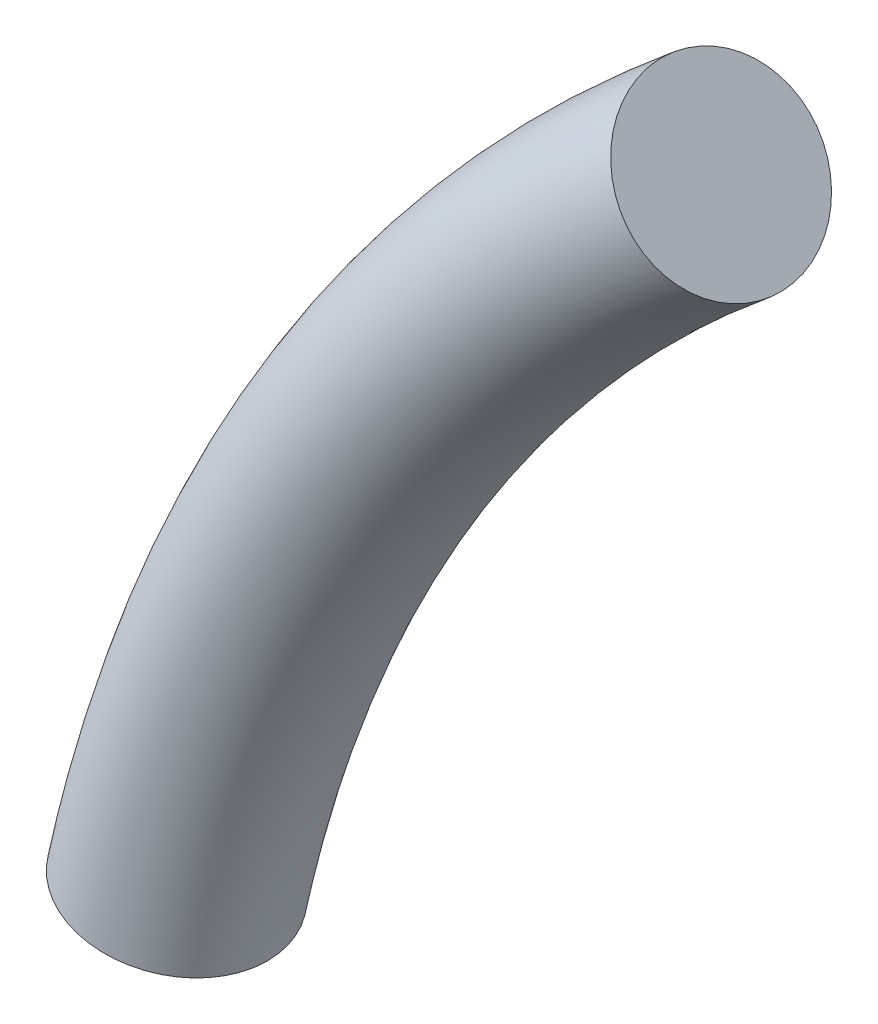
ISO-10303-21;
HEADER;
FILE_DESCRIPTION(('STEP AP214'),'2;1');
FILE_NAME('part.step','',(''),(''),'','','');
FILE_SCHEMA(('AUTOMOTIVE_DESIGN { 1 0 10303 214 1 1 1 1 }'));
ENDSEC;
DATA;
#1=APPLICATION_CONTEXT('core data for automotive mechanical design processes');
#2=APPLICATION_PROTOCOL_DEFINITION('international standard','automotive_design',2000,#1);
#3=PRODUCT_CONTEXT('',#1,'mechanical');
#4=PRODUCT('Part','Part','',(#3));
#5=PRODUCT_RELATED_PRODUCT_CATEGORY('part','',(#4));
#6=PRODUCT_DEFINITION_FORMATION('','',#4);
#7=PRODUCT_DEFINITION_CONTEXT('part definition',#1,'design');
#8=PRODUCT_DEFINITION('design','',#6,#7);
#9=PRODUCT_DEFINITION_SHAPE('','',#8);
#10=(LENGTH_UNIT() NAMED_UNIT(*) SI_UNIT(.MILLI.,.METRE.));
#11=(NAMED_UNIT(*) PLANE_ANGLE_UNIT() SI_UNIT($,.RADIAN.));
#12=(NAMED_UNIT(*) SI_UNIT($,.STERADIAN.) SOLID_ANGLE_UNIT());
#13=UNCERTAINTY_MEASURE_WITH_UNIT(LENGTH_MEASURE(1.E-05),#10,'distance_accuracy_value','');
#14=(GEOMETRIC_REPRESENTATION_CONTEXT(3) GLOBAL_UNCERTAINTY_ASSIGNED_CONTEXT((#13)) GLOBAL_UNIT_ASSIGNED_CONTEXT((#10,
#11,#12)) REPRESENTATION_CONTEXT('',''));
#15=CARTESIAN_POINT('',(0.,0.,0.));
#16=DIRECTION('',(0.,0.,1.));
#17=DIRECTION('',(1.,0.,0.));
#18=AXIS2_PLACEMENT_3D('',#15,#16,#17);
#19=CARTESIAN_POINT('',(0.,0.,-107.5));
#20=DIRECTION('',(0.772045723694162,0.635566991375069,0.));
#21=DIRECTION('',(-0.635566991375069,0.772045723694162,0.));
#22=AXIS2_PLACEMENT_3D('',#19,#20,#21);
#23=PLANE('',#22);
#24=CARTESIAN_POINT('',(-4.61559923705178,5.60673178690762,-102.2302));
#25=CARTESIAN_POINT('',(-4.61559806399958,5.60673036195958,-102.25265524156));
#26=CARTESIAN_POINT('',(-4.61439302773352,5.60526656174854,-102.275130857259));
#27=CARTESIAN_POINT('',(-4.60959900233538,5.59944308938742,-102.319482451298));
#28=CARTESIAN_POINT('',(-4.6060049110068,5.59507721941863,-102.341357041711));
#29=CARTESIAN_POINT('',(-4.59653985086311,5.58357967579599,-102.383809618347));
#30=CARTESIAN_POINT('',(-4.59067294587423,5.57645293861573,-102.404389843003));
#31=CARTESIAN_POINT('',(-4.57681791763067,5.55962274533592,-102.443737337222));
#32=CARTESIAN_POINT('',(-4.56882678519054,5.5499156338723,-102.46250198299));
#33=CARTESIAN_POINT('',(-4.55096715734002,5.52822091168585,-102.497627484938));
#34=CARTESIAN_POINT('',(-4.54110132501634,5.51623653590871,-102.513991693303));
#35=CARTESIAN_POINT('',(-4.51974956870048,5.49029980165297,-102.543904884907));
#36=CARTESIAN_POINT('',(-4.50826139607385,5.47634471167849,-102.557449895039));
#37=CARTESIAN_POINT('',(-4.48401094231869,5.44688682702843,-102.581301941874));
#38=CARTESIAN_POINT('',(-4.47124959529363,5.43138516704139,-102.5916113298));
#39=CARTESIAN_POINT('',(-4.44480721644859,5.39926467338982,-102.608713483024));
#40=CARTESIAN_POINT('',(-4.43112613057636,5.38264577406609,-102.615506041437));
#41=CARTESIAN_POINT('',(-4.40323376461533,5.34876392973473,-102.625380612929));
#42=CARTESIAN_POINT('',(-4.38902250013063,5.33150100368193,-102.628462735124));
#43=CARTESIAN_POINT('',(-4.36047280865081,5.29682068277336,-102.630829316177));
#44=CARTESIAN_POINT('',(-4.34613438165569,5.27940328791758,-102.630113775036));
#45=CARTESIAN_POINT('',(-4.3177369672946,5.24490794341578,-102.624905254934));
#46=CARTESIAN_POINT('',(-4.30367798815917,5.22783000376772,-102.620412164882));
#47=CARTESIAN_POINT('',(-4.27623985107368,5.1944999273313,-102.607776350926));
#48=CARTESIAN_POINT('',(-4.2628606531871,5.17824774203067,-102.599633841699));
#49=CARTESIAN_POINT('',(-4.23715152571213,5.14701795477565,-102.579923114515));
#50=CARTESIAN_POINT('',(-4.22482236803333,5.13204129048716,-102.568352403919));
#51=CARTESIAN_POINT('',(-4.20159110691616,5.10382145521421,-102.542134850302));
#52=CARTESIAN_POINT('',(-4.19068703262939,5.09057589017041,-102.527492330157));
#53=CARTESIAN_POINT('',(-4.17058047180824,5.0661517389624,-102.495513974748));
#54=CARTESIAN_POINT('',(-4.16138040974767,5.05497609789235,-102.478174365578));
#55=CARTESIAN_POINT('',(-4.14497432022954,5.03504704017396,-102.441335318358));
#56=CARTESIAN_POINT('',(-4.13776547547123,5.02629020125068,-102.421838987082));
#57=CARTESIAN_POINT('',(-4.12551768347878,5.01141237474177,-102.381186262625));
#58=CARTESIAN_POINT('',(-4.1204826280836,5.0052961147107,-102.36002697154));
#59=CARTESIAN_POINT('',(-4.11275318948671,4.99590689202251,-102.316713490036));
#60=CARTESIAN_POINT('',(-4.1100538250242,4.99262787845155,-102.294561523395));
#61=CARTESIAN_POINT('',(-4.10761472693063,4.98966501965245,-102.258269762147));
#62=CARTESIAN_POINT('',(-4.10714491056754,4.98909431708456,-102.244238862857));
#63=CARTESIAN_POINT('',(-4.10714681700393,4.98909663290033,-102.20774475844));
#64=CARTESIAN_POINT('',(-4.10835185326999,4.99056043311137,-102.185269142741));
#65=CARTESIAN_POINT('',(-4.11314587866813,4.9963839054725,-102.140917548703));
#66=CARTESIAN_POINT('',(-4.11673996999671,5.00074977544129,-102.119042958289));
#67=CARTESIAN_POINT('',(-4.1262050301404,5.01224731906392,-102.076590381653));
#68=CARTESIAN_POINT('',(-4.13207193512927,5.01937405624419,-102.056010156997));
#69=CARTESIAN_POINT('',(-4.14592696337284,5.03620424952399,-102.016662662778));
#70=CARTESIAN_POINT('',(-4.15391809581297,5.04591136098761,-101.99789801701));
#71=CARTESIAN_POINT('',(-4.17177772366349,5.06760608317407,-101.962772515062));
#72=CARTESIAN_POINT('',(-4.18164355598717,5.0795904589512,-101.946408306697));
#73=CARTESIAN_POINT('',(-4.20299531230302,5.10552719320694,-101.916495115093));
#74=CARTESIAN_POINT('',(-4.21448348492966,5.11948228318143,-101.902950104961));
#75=CARTESIAN_POINT('',(-4.23873393868482,5.14894016783149,-101.879098058126));
#76=CARTESIAN_POINT('',(-4.25149528570988,5.16444182781852,-101.8687886702));
#77=CARTESIAN_POINT('',(-4.27793766455492,5.19656232147009,-101.851686516976));
#78=CARTESIAN_POINT('',(-4.29161875042715,5.21318122079382,-101.844893958563));
#79=CARTESIAN_POINT('',(-4.31951111638817,5.24706306512519,-101.835019387071));
#80=CARTESIAN_POINT('',(-4.33372238087288,5.26432599117798,-101.831937264876));
#81=CARTESIAN_POINT('',(-4.3622720723527,5.29900631208656,-101.829570683823));
#82=CARTESIAN_POINT('',(-4.37661049934782,5.31642370694233,-101.830286224964));
#83=CARTESIAN_POINT('',(-4.40500791370891,5.35091905144413,-101.835494745066));
#84=CARTESIAN_POINT('',(-4.41906689284433,5.3679969910922,-101.839987835118));
#85=CARTESIAN_POINT('',(-4.44650502992983,5.40132706752861,-101.852623649074));
#86=CARTESIAN_POINT('',(-4.45988422781641,5.41757925282924,-101.860766158301));
#87=CARTESIAN_POINT('',(-4.48559335529138,5.44880904008426,-101.880476885485));
#88=CARTESIAN_POINT('',(-4.49792251297018,5.46378570437275,-101.892047596081));
#89=CARTESIAN_POINT('',(-4.52115377408734,5.4920055396457,-101.918265149698));
#90=CARTESIAN_POINT('',(-4.53205784837412,5.5052511046895,-101.932907669844));
#91=CARTESIAN_POINT('',(-4.55216440919527,5.52967525589751,-101.964886025252));
#92=CARTESIAN_POINT('',(-4.56136447125583,5.54085089696756,-101.982225634422));
#93=CARTESIAN_POINT('',(-4.57777056077397,5.56077995468596,-102.019064681642));
#94=CARTESIAN_POINT('',(-4.58497940553227,5.56953679360924,-102.038561012918));
#95=CARTESIAN_POINT('',(-4.59722719752472,5.58441462011814,-102.079213737375));
#96=CARTESIAN_POINT('',(-4.60226225291991,5.59053088014922,-102.10037302846));
#97=CARTESIAN_POINT('',(-4.6099916915168,5.59992010283741,-102.143686509964));
#98=CARTESIAN_POINT('',(-4.61269105597931,5.60319911640836,-102.165838476605));
#99=CARTESIAN_POINT('',(-4.61513015407288,5.60616197520746,-102.202130237853));
#100=CARTESIAN_POINT('',(-4.61559997043597,5.60673267777535,-102.216161137143));
#101=CARTESIAN_POINT('',(-4.61559923705178,5.60673178690762,-102.2302));
#102=B_SPLINE_CURVE_WITH_KNOTS('',3,(#24,#25,#26,#27,#28,#29,#30,#31,#32,#33,#34,#35,#36,#37,
#38,#39,#40,#41,#42,#43,#44,#45,#46,#47,#48,#49,#50,#51,#52,#53,#54,#55,#56,#57,#58,#59,#60,#61,
#62,#63,#64,#65,#66,#67,#68,#69,#70,#71,#72,#73,#74,#75,#76,#77,#78,#79,#80,#81,#82,#83,#84,#85,
#86,#87,#88,#89,#90,#91,#92,#93,#94,#95,#96,#97,#98,#99,#100,#101),.UNSPECIFIED.,.T.,.F.,(4,2,2,
2,2,2,2,2,2,2,2,2,2,2,2,2,2,2,2,2,2,2,2,2,2,2,2,2,2,2,2,2,2,2,2,2,2,2,4),(0.,0.0673217190940812,
0.134787678055445,0.202133559490878,0.269575356418609,0.336922056232666,0.404363034793442,
0.47175489208364,0.53915071340354,0.606544552708793,0.673938392014051,0.741334213333949,
0.808726070624146,0.876167049184932,0.943513748998995,1.01095554592845,1.07830142736559,
1.1457673863287,1.21308910542448,1.25517818200736,1.32249990110144,1.3899658600628,
1.45731174149823,1.52475353842596,1.59210023824002,1.6595412168008,1.726933074091,
1.7943288954109,1.86172273471615,1.92911657402141,1.9965123953413,2.0639042526315,
2.13134523119229,2.19869193100635,2.2661337279358,2.33347960937294,2.40094556833606,
2.46826728743184,2.51035636401471),.UNSPECIFIED.);
#103=CARTESIAN_POINT('',(-4.61559923705178,5.60673178690762,-102.2302));
#104=VERTEX_POINT('',#103);
#105=EDGE_CURVE('E19',#104,#104,#102,.T.);
#106=ORIENTED_EDGE('',*,*,#105,.F.);
#107=EDGE_LOOP('',(#106));
#108=FACE_BOUND('',#107,.T.);
#109=ADVANCED_FACE('F15',(#108),#23,.T.);
#110=CARTESIAN_POINT('',(0.,0.,-107.5));
#111=DIRECTION('',(0.217086220968817,0.976152433109439,0.));
#112=DIRECTION('',(-0.976152433109439,0.217086220968817,0.));
#113=AXIS2_PLACEMENT_3D('',#110,#111,#112);
#114=PLANE('',#113);
#115=CARTESIAN_POINT('',(-6.30806865033105,1.40284932810151,-102.2302));
#116=CARTESIAN_POINT('',(-6.30807045199442,1.40284972877284,-102.25265524156));
#117=CARTESIAN_POINT('',(-6.30992123892807,1.40326132467489,-102.275130857259));
#118=CARTESIAN_POINT('',(-6.31728427008023,1.40489878676942,-102.319482451298));
#119=CARTESIAN_POINT('',(-6.32280435064267,1.40612639568386,-102.341357041711));
#120=CARTESIAN_POINT('',(-6.33734151448876,1.40935931080645,-102.383809618347));
#121=CARTESIAN_POINT('',(-6.34635235623704,1.41136322896158,-102.404389843003));
#122=CARTESIAN_POINT('',(-6.36763196910916,1.41609559512224,-102.443737337222));
#123=CARTESIAN_POINT('',(-6.37990536197031,1.41882507095441,-102.46250198299));
#124=CARTESIAN_POINT('',(-6.40733554544003,1.42492526050263,-102.497627484938));
#125=CARTESIAN_POINT('',(-6.42248824587618,1.42829506460657,-102.513991693303));
#126=CARTESIAN_POINT('',(-6.45528190753848,1.43558803631931,-102.543904884907));
#127=CARTESIAN_POINT('',(-6.47292632238955,1.43951197197865,-102.557449895039));
#128=CARTESIAN_POINT('',(-6.51017202545209,1.44779503172519,-102.581301941874));
#129=CARTESIAN_POINT('',(-6.52977187899596,1.45215383675713,-102.5916113298));
#130=CARTESIAN_POINT('',(-6.57038410838651,1.46118557719487,-102.608713483024));
#131=CARTESIAN_POINT('',(-6.59139656725079,1.46585853106292,-102.615506041437));
#132=CARTESIAN_POINT('',(-6.63423579783941,1.47538553357018,-102.625380612929));
#133=CARTESIAN_POINT('',(-6.65606254559781,1.4802395768796,-102.628462735124));
#134=CARTESIAN_POINT('',(-6.6999113470314,1.48999109751753,-102.630829316177));
#135=CARTESIAN_POINT('',(-6.72193340070659,1.49488857484604,-102.630113775036));
#136=CARTESIAN_POINT('',(-6.76554832328561,1.50458808324184,-102.624905254934));
#137=CARTESIAN_POINT('',(-6.78714117954831,1.50939011149787,-102.620412164882));
#138=CARTESIAN_POINT('',(-6.82928277066217,1.51876196619005,-102.607776350926));
#139=CARTESIAN_POINT('',(-6.84983156685087,1.52333180626704,-102.599633841699));
#140=CARTESIAN_POINT('',(-6.88931761266253,1.53211309510627,-102.579923114515));
#141=CARTESIAN_POINT('',(-6.90825367672765,1.5363242802127,-102.568352403919));
#142=CARTESIAN_POINT('',(-6.94393402572541,1.54425922137973,-102.542134850302));
#143=CARTESIAN_POINT('',(-6.96068133763791,1.54798365060938,-102.527492330157));
#144=CARTESIAN_POINT('',(-6.99156253274932,1.55485130951014,-102.495513974748));
#145=CARTESIAN_POINT('',(-7.00569269225578,1.55799371107049,-102.478174365578));
#146=CARTESIAN_POINT('',(-7.03089042029747,1.56359742558477,-102.441335318358));
#147=CARTESIAN_POINT('',(-7.04196231585879,1.56605970082463,-102.421838987082));
#148=CARTESIAN_POINT('',(-7.06077341227489,1.57024309441639,-102.381186262625));
#149=CARTESIAN_POINT('',(-7.06850663574551,1.57196288345978,-102.36002697154));
#150=CARTESIAN_POINT('',(-7.08037809917158,1.57460297433608,-102.316713490036));
#151=CARTESIAN_POINT('',(-7.08452398972864,1.57552497758379,-102.294561523395));
#152=CARTESIAN_POINT('',(-7.08827014327491,1.57635808344815,-102.258269762147));
#153=CARTESIAN_POINT('',(-7.08899172320617,1.57651855537353,-102.244238862857));
#154=CARTESIAN_POINT('',(-7.08898879515524,1.57651790420524,-102.20774475844));
#155=CARTESIAN_POINT('',(-7.08713800822159,1.57610630830318,-102.185269142741));
#156=CARTESIAN_POINT('',(-7.07977497706943,1.57446884620865,-102.140917548703));
#157=CARTESIAN_POINT('',(-7.07425489650699,1.57324123729421,-102.119042958289));
#158=CARTESIAN_POINT('',(-7.0597177326609,1.57000832217162,-102.076590381653));
#159=CARTESIAN_POINT('',(-7.05070689091261,1.56800440401649,-102.056010156997));
#160=CARTESIAN_POINT('',(-7.0294272780405,1.56327203785584,-102.016662662778));
#161=CARTESIAN_POINT('',(-7.01715388517934,1.56054256202366,-101.99789801701));
#162=CARTESIAN_POINT('',(-6.98972370170962,1.55444237247544,-101.962772515062));
#163=CARTESIAN_POINT('',(-6.97457100127347,1.55107256837151,-101.946408306697));
#164=CARTESIAN_POINT('',(-6.94177733961117,1.54377959665876,-101.916495115093));
#165=CARTESIAN_POINT('',(-6.9241329247601,1.53985566099942,-101.902950104961));
#166=CARTESIAN_POINT('',(-6.88688722169756,1.53157260125288,-101.879098058126));
#167=CARTESIAN_POINT('',(-6.86728736815369,1.52721379622094,-101.8687886702));
#168=CARTESIAN_POINT('',(-6.82667513876315,1.5181820557832,-101.851686516976));
#169=CARTESIAN_POINT('',(-6.80566267989887,1.51350910191515,-101.844893958563));
#170=CARTESIAN_POINT('',(-6.76282344931025,1.50398209940789,-101.835019387071));
#171=CARTESIAN_POINT('',(-6.74099670155185,1.49912805609847,-101.831937264876));
#172=CARTESIAN_POINT('',(-6.69714790011825,1.48937653546054,-101.829570683823));
#173=CARTESIAN_POINT('',(-6.67512584644306,1.48447905813204,-101.830286224964));
#174=CARTESIAN_POINT('',(-6.63151092386405,1.47477954973624,-101.835494745066));
#175=CARTESIAN_POINT('',(-6.60991806760135,1.4699775214802,-101.839987835118));
#176=CARTESIAN_POINT('',(-6.56777647648749,1.46060566678802,-101.852623649074));
#177=CARTESIAN_POINT('',(-6.54722768029878,1.45603582671104,-101.860766158301));
#178=CARTESIAN_POINT('',(-6.50774163448713,1.4472545378718,-101.880476885485));
#179=CARTESIAN_POINT('',(-6.48880557042202,1.44304335276537,-101.892047596081));
#180=CARTESIAN_POINT('',(-6.45312522142426,1.43510841159835,-101.918265149698));
#181=CARTESIAN_POINT('',(-6.43637790951176,1.43138398236869,-101.932907669843));
#182=CARTESIAN_POINT('',(-6.40549671440034,1.42451632346794,-101.964886025252));
#183=CARTESIAN_POINT('',(-6.39136655489388,1.42137392190758,-101.982225634422));
#184=CARTESIAN_POINT('',(-6.36616882685219,1.4157702073933,-102.019064681642));
#185=CARTESIAN_POINT('',(-6.35509693129087,1.41330793215344,-102.038561012918));
#186=CARTESIAN_POINT('',(-6.33628583487476,1.40912453856168,-102.079213737375));
#187=CARTESIAN_POINT('',(-6.32855261140414,1.40740474951829,-102.10037302846));
#188=CARTESIAN_POINT('',(-6.31668114797808,1.40476465864199,-102.143686509964));
#189=CARTESIAN_POINT('',(-6.31253525742101,1.40384265539428,-102.165838476605));
#190=CARTESIAN_POINT('',(-6.30878910387474,1.40300954952992,-102.202130237853));
#191=CARTESIAN_POINT('',(-6.30806752394349,1.40284907760455,-102.216161137143));
#192=CARTESIAN_POINT('',(-6.30806865033105,1.40284932810151,-102.2302));
#193=B_SPLINE_CURVE_WITH_KNOTS('',3,(#115,#116,#117,#118,#119,#120,#121,#122,#123,#124,#125,
#126,#127,#128,#129,#130,#131,#132,#133,#134,#135,#136,#137,#138,#139,#140,#141,#142,#143,#144,
#145,#146,#147,#148,#149,#150,#151,#152,#153,#154,#155,#156,#157,#158,#159,#160,#161,#162,#163,
#164,#165,#166,#167,#168,#169,#170,#171,#172,#173,#174,#175,#176,#177,#178,#179,#180,#181,#182,
#183,#184,#185,#186,#187,#188,#189,#190,#191,#192),.UNSPECIFIED.,.T.,.F.,(4,2,2,2,2,2,2,2,2,2,2,
2,2,2,2,2,2,2,2,2,2,2,2,2,2,2,2,2,2,2,2,2,2,2,2,2,2,2,4),(0.,0.0673217190940813,
0.134787678055445,0.202133559490878,0.269575356418609,0.336922056232665,0.404363034793442,
0.47175489208364,0.539150713403541,0.606544552708796,0.673938392014055,0.741334213333952,
0.808726070624148,0.876167049184934,0.943513748998995,1.01095554592844,1.07830142736559,
1.14576738632871,1.21308910542448,1.25517818200736,1.32249990110144,1.3899658600628,
1.45731174149823,1.52475353842597,1.59210023824002,1.6595412168008,1.72693307409099,
1.7943288954109,1.86172273471615,1.92911657402141,1.99651239534131,2.0639042526315,
2.13134523119227,2.19869193100634,2.26613372793579,2.33347960937294,2.40094556833606,
2.46826728743184,2.51035636401471),.UNSPECIFIED.);
#194=CARTESIAN_POINT('',(-6.30806865033105,1.40284932810151,-102.2302));
#195=VERTEX_POINT('',#194);
#196=EDGE_CURVE('E10',#195,#195,#193,.T.);
#197=ORIENTED_EDGE('',*,*,#196,.F.);
#198=EDGE_LOOP('',(#197));
#199=FACE_BOUND('',#198,.T.);
#200=ADVANCED_FACE('F35',(#199),#114,.F.);
#201=CARTESIAN_POINT('',(0.,0.,-102.2302));
#202=DIRECTION('',(0.,0.,1.));
#203=DIRECTION('',(0.772045723694162,0.635566991375069,0.));
#204=AXIS2_PLACEMENT_3D('',#201,#202,#203);
#205=TOROIDAL_SURFACE('',#204,6.86217582046821,0.4);
#206=ORIENTED_EDGE('',*,*,#105,.T.);
#207=EDGE_LOOP('',(#206));
#208=FACE_BOUND('',#207,.T.);
#209=ORIENTED_EDGE('',*,*,#196,.T.);
#210=EDGE_LOOP('',(#209));
#211=FACE_BOUND('',#210,.T.);
#212=ADVANCED_FACE('F37',(#208,#211),#205,.T.);
#213=CLOSED_SHELL('',(#109,#200,#212));
#214=MANIFOLD_SOLID_BREP('B1',#213);
#215=ADVANCED_BREP_SHAPE_REPRESENTATION('',(#18,#214),#14);
#216=SHAPE_DEFINITION_REPRESENTATION(#9,#215);
ENDSEC;
END-ISO-10303-21;
